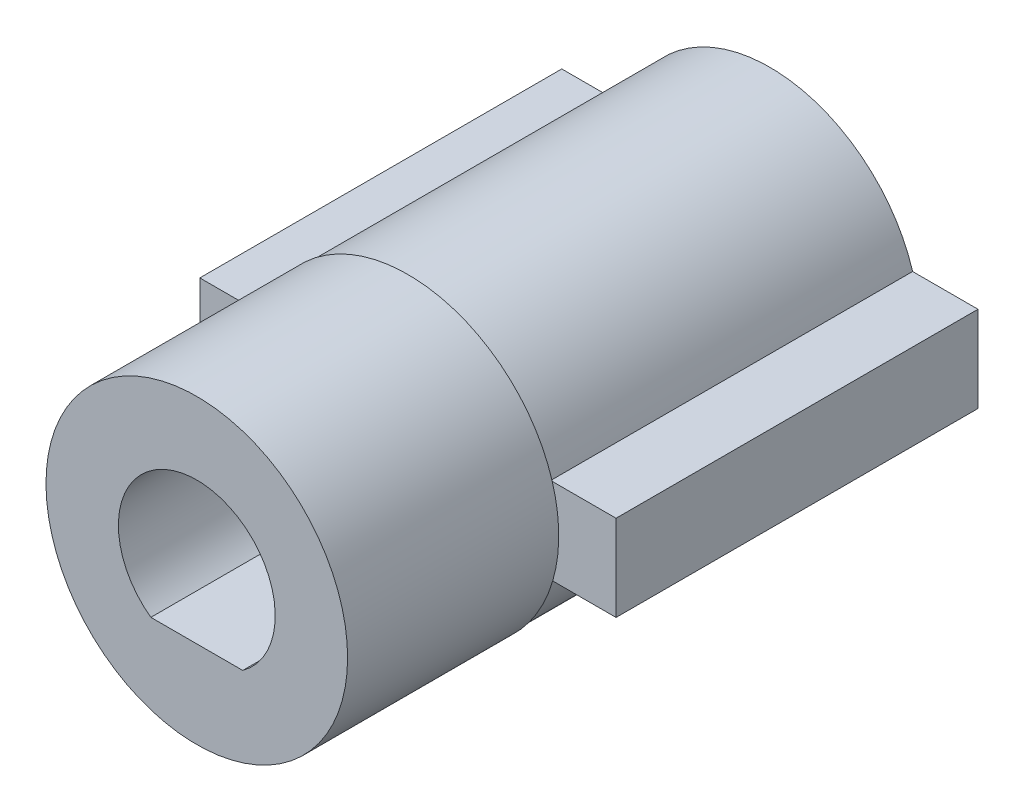
ISO-10303-21;
HEADER;
FILE_DESCRIPTION(('STEP AP214'),'2;1');
FILE_NAME('part.step','',(''),(''),'','','');
FILE_SCHEMA(('AUTOMOTIVE_DESIGN { 1 0 10303 214 1 1 1 1 }'));
ENDSEC;
DATA;
#1=APPLICATION_CONTEXT('core data for automotive mechanical design processes');
#2=APPLICATION_PROTOCOL_DEFINITION('international standard','automotive_design',2000,#1);
#3=PRODUCT_CONTEXT('',#1,'mechanical');
#4=PRODUCT('Part','Part','',(#3));
#5=PRODUCT_RELATED_PRODUCT_CATEGORY('part','',(#4));
#6=PRODUCT_DEFINITION_FORMATION('','',#4);
#7=PRODUCT_DEFINITION_CONTEXT('part definition',#1,'design');
#8=PRODUCT_DEFINITION('design','',#6,#7);
#9=PRODUCT_DEFINITION_SHAPE('','',#8);
#10=(LENGTH_UNIT() NAMED_UNIT(*) SI_UNIT(.MILLI.,.METRE.));
#11=(NAMED_UNIT(*) PLANE_ANGLE_UNIT() SI_UNIT($,.RADIAN.));
#12=(NAMED_UNIT(*) SI_UNIT($,.STERADIAN.) SOLID_ANGLE_UNIT());
#13=UNCERTAINTY_MEASURE_WITH_UNIT(LENGTH_MEASURE(1.E-05),#10,'distance_accuracy_value','');
#14=(GEOMETRIC_REPRESENTATION_CONTEXT(3) GLOBAL_UNCERTAINTY_ASSIGNED_CONTEXT((#13)) GLOBAL_UNIT_ASSIGNED_CONTEXT((#10,
#11,#12)) REPRESENTATION_CONTEXT('',''));
#15=CARTESIAN_POINT('',(0.,0.,0.));
#16=DIRECTION('',(0.,0.,1.));
#17=DIRECTION('',(1.,0.,0.));
#18=AXIS2_PLACEMENT_3D('',#15,#16,#17);
#19=CARTESIAN_POINT('',(0.,0.,12.));
#20=DIRECTION('',(0.,0.,1.));
#21=DIRECTION('',(1.,0.,0.));
#22=AXIS2_PLACEMENT_3D('',#19,#20,#21);
#23=PLANE('',#22);
#24=CARTESIAN_POINT('',(0.,0.,12.));
#25=DIRECTION('',(0.,0.,1.));
#26=DIRECTION('',(1.,0.,0.));
#27=AXIS2_PLACEMENT_3D('',#24,#25,#26);
#28=CIRCLE('',#27,5.);
#29=CARTESIAN_POINT('',(-4.78476498801188,1.45121466692412,12.));
#30=VERTEX_POINT('',#29);
#31=CARTESIAN_POINT('',(-4.80035411110178,-1.39878533307588,12.));
#32=VERTEX_POINT('',#31);
#33=EDGE_CURVE('E47',#30,#32,#28,.T.);
#34=ORIENTED_EDGE('',*,*,#33,.F.);
#35=DIRECTION('',(-1.,0.,0.));
#36=VECTOR('',#35,1.);
#37=CARTESIAN_POINT('',(-6.9,1.45121466692412,12.));
#38=LINE('',#37,#36);
#39=CARTESIAN_POINT('',(-6.9,1.45121466692412,12.));
#40=VERTEX_POINT('',#39);
#41=EDGE_CURVE('E169',#30,#40,#38,.T.);
#42=ORIENTED_EDGE('',*,*,#41,.T.);
#43=DIRECTION('',(0.,-1.,0.));
#44=VECTOR('',#43,1.);
#45=CARTESIAN_POINT('',(-6.9,-1.39878533307588,12.));
#46=LINE('',#45,#44);
#47=CARTESIAN_POINT('',(-6.9,-1.39878533307588,12.));
#48=VERTEX_POINT('',#47);
#49=EDGE_CURVE('E174',#40,#48,#46,.T.);
#50=ORIENTED_EDGE('',*,*,#49,.T.);
#51=DIRECTION('',(1.,0.,0.));
#52=VECTOR('',#51,1.);
#53=CARTESIAN_POINT('',(-6.9,-1.39878533307588,12.));
#54=LINE('',#53,#52);
#55=EDGE_CURVE('E177',#48,#32,#54,.T.);
#56=ORIENTED_EDGE('',*,*,#55,.T.);
#57=EDGE_LOOP('',(#34,#42,#50,#56));
#58=FACE_BOUND('',#57,.T.);
#59=ADVANCED_FACE('F39',(#58),#23,.T.);
#60=CARTESIAN_POINT('',(4.80035411110178,-1.39878533307588,12.));
#61=VERTEX_POINT('',#60);
#62=CARTESIAN_POINT('',(4.78476498801188,1.45121466692412,12.));
#63=VERTEX_POINT('',#62);
#64=EDGE_CURVE('E60',#61,#63,#28,.T.);
#65=ORIENTED_EDGE('',*,*,#64,.F.);
#66=DIRECTION('',(1.,0.,0.));
#67=VECTOR('',#66,1.);
#68=CARTESIAN_POINT('',(4.74825226709489,-1.39878533307588,12.));
#69=LINE('',#68,#67);
#70=CARTESIAN_POINT('',(6.9,-1.39878533307588,12.));
#71=VERTEX_POINT('',#70);
#72=EDGE_CURVE('E183',#61,#71,#69,.T.);
#73=ORIENTED_EDGE('',*,*,#72,.T.);
#74=DIRECTION('',(0.,1.,0.));
#75=VECTOR('',#74,1.);
#76=CARTESIAN_POINT('',(6.9,-1.39878533307588,12.));
#77=LINE('',#76,#75);
#78=CARTESIAN_POINT('',(6.9,1.45121466692412,12.));
#79=VERTEX_POINT('',#78);
#80=EDGE_CURVE('E187',#71,#79,#77,.T.);
#81=ORIENTED_EDGE('',*,*,#80,.T.);
#82=DIRECTION('',(-1.,0.,0.));
#83=VECTOR('',#82,1.);
#84=CARTESIAN_POINT('',(4.73249152038377,1.45121466692412,12.));
#85=LINE('',#84,#83);
#86=EDGE_CURVE('E190',#79,#63,#85,.T.);
#87=ORIENTED_EDGE('',*,*,#86,.T.);
#88=EDGE_LOOP('',(#65,#73,#81,#87));
#89=FACE_BOUND('',#88,.T.);
#90=ADVANCED_FACE('F246',(#89),#23,.T.);
#91=CARTESIAN_POINT('',(0.,0.,0.));
#92=DIRECTION('',(0.,0.,1.));
#93=DIRECTION('',(1.,0.,0.));
#94=AXIS2_PLACEMENT_3D('',#91,#92,#93);
#95=PLANE('',#94);
#96=CARTESIAN_POINT('',(0.,0.,0.));
#97=DIRECTION('',(0.,0.,1.));
#98=DIRECTION('',(1.,0.,0.));
#99=AXIS2_PLACEMENT_3D('',#96,#97,#98);
#100=CIRCLE('',#99,4.95);
#101=CARTESIAN_POINT('',(4.73249152038377,1.45121466692412,0.));
#102=VERTEX_POINT('',#101);
#103=CARTESIAN_POINT('',(-4.73249152038377,1.45121466692412,0.));
#104=VERTEX_POINT('',#103);
#105=EDGE_CURVE('E165',#102,#104,#100,.T.);
#106=ORIENTED_EDGE('',*,*,#105,.F.);
#107=DIRECTION('',(-1.,0.,0.));
#108=VECTOR('',#107,1.);
#109=CARTESIAN_POINT('',(4.73249152038377,1.45121466692412,0.));
#110=LINE('',#109,#108);
#111=CARTESIAN_POINT('',(6.9,1.45121466692412,0.));
#112=VERTEX_POINT('',#111);
#113=EDGE_CURVE('E170',#112,#102,#110,.T.);
#114=ORIENTED_EDGE('',*,*,#113,.F.);
#115=DIRECTION('',(0.,1.,0.));
#116=VECTOR('',#115,1.);
#117=CARTESIAN_POINT('',(6.9,-1.39878533307588,0.));
#118=LINE('',#117,#116);
#119=CARTESIAN_POINT('',(6.9,-1.39878533307588,0.));
#120=VERTEX_POINT('',#119);
#121=EDGE_CURVE('E205',#120,#112,#118,.T.);
#122=ORIENTED_EDGE('',*,*,#121,.F.);
#123=DIRECTION('',(1.,0.,0.));
#124=VECTOR('',#123,1.);
#125=CARTESIAN_POINT('',(4.74825226709489,-1.39878533307588,0.));
#126=LINE('',#125,#124);
#127=CARTESIAN_POINT('',(4.74825226709489,-1.39878533307588,0.));
#128=VERTEX_POINT('',#127);
#129=EDGE_CURVE('E203',#128,#120,#126,.T.);
#130=ORIENTED_EDGE('',*,*,#129,.F.);
#131=CARTESIAN_POINT('',(0.,0.,0.));
#132=DIRECTION('',(0.,0.,1.));
#133=DIRECTION('',(1.,0.,0.));
#134=AXIS2_PLACEMENT_3D('',#131,#132,#133);
#135=CIRCLE('',#134,4.95);
#136=CARTESIAN_POINT('',(-4.74825226709489,-1.39878533307588,0.));
#137=VERTEX_POINT('',#136);
#138=EDGE_CURVE('E201',#137,#128,#135,.T.);
#139=ORIENTED_EDGE('',*,*,#138,.F.);
#140=DIRECTION('',(1.,0.,0.));
#141=VECTOR('',#140,1.);
#142=CARTESIAN_POINT('',(-6.9,-1.39878533307588,0.));
#143=LINE('',#142,#141);
#144=CARTESIAN_POINT('',(-6.9,-1.39878533307588,0.));
#145=VERTEX_POINT('',#144);
#146=EDGE_CURVE('E199',#145,#137,#143,.T.);
#147=ORIENTED_EDGE('',*,*,#146,.F.);
#148=DIRECTION('',(0.,-1.,0.));
#149=VECTOR('',#148,1.);
#150=CARTESIAN_POINT('',(-6.9,-1.39878533307588,0.));
#151=LINE('',#150,#149);
#152=CARTESIAN_POINT('',(-6.9,1.45121466692412,0.));
#153=VERTEX_POINT('',#152);
#154=EDGE_CURVE('E197',#153,#145,#151,.T.);
#155=ORIENTED_EDGE('',*,*,#154,.F.);
#156=DIRECTION('',(-1.,0.,0.));
#157=VECTOR('',#156,1.);
#158=CARTESIAN_POINT('',(-6.9,1.45121466692412,0.));
#159=LINE('',#158,#157);
#160=EDGE_CURVE('E195',#104,#153,#159,.T.);
#161=ORIENTED_EDGE('',*,*,#160,.F.);
#162=EDGE_LOOP('',(#106,#114,#122,#130,#139,#147,#155,#161));
#163=FACE_BOUND('',#162,.T.);
#164=CARTESIAN_POINT('',(0.,0.,0.));
#165=DIRECTION('',(0.,0.,1.));
#166=DIRECTION('',(1.,0.,0.));
#167=AXIS2_PLACEMENT_3D('',#164,#165,#166);
#168=CIRCLE('',#167,1.49);
#169=CARTESIAN_POINT('',(1.49,0.,0.));
#170=VERTEX_POINT('',#169);
#171=EDGE_CURVE('E151',#170,#170,#168,.T.);
#172=ORIENTED_EDGE('',*,*,#171,.T.);
#173=EDGE_LOOP('',(#172));
#174=FACE_BOUND('',#173,.T.);
#175=ADVANCED_FACE('F266',(#163,#174),#95,.F.);
#176=CARTESIAN_POINT('',(0.,0.,12.));
#177=DIRECTION('',(0.,0.,-1.));
#178=DIRECTION('',(-1.,0.,0.));
#179=AXIS2_PLACEMENT_3D('',#176,#177,#178);
#180=CYLINDRICAL_SURFACE('',#179,4.95);
#181=ORIENTED_EDGE('',*,*,#105,.T.);
#182=DIRECTION('',(0.,0.,-1.));
#183=VECTOR('',#182,1.);
#184=CARTESIAN_POINT('',(-4.73249152038377,1.45121466692412,12.));
#185=LINE('',#184,#183);
#186=CARTESIAN_POINT('',(-4.73249152038377,1.45121466692412,12.));
#187=VERTEX_POINT('',#186);
#188=EDGE_CURVE('E227',#187,#104,#185,.T.);
#189=ORIENTED_EDGE('',*,*,#188,.F.);
#190=CARTESIAN_POINT('',(0.,0.,12.));
#191=DIRECTION('',(0.,0.,1.));
#192=DIRECTION('',(1.,0.,0.));
#193=AXIS2_PLACEMENT_3D('',#190,#191,#192);
#194=CIRCLE('',#193,4.95);
#195=CARTESIAN_POINT('',(4.73249152038377,1.45121466692412,12.));
#196=VERTEX_POINT('',#195);
#197=EDGE_CURVE('E166',#196,#187,#194,.T.);
#198=ORIENTED_EDGE('',*,*,#197,.F.);
#199=DIRECTION('',(0.,0.,-1.));
#200=VECTOR('',#199,1.);
#201=CARTESIAN_POINT('',(4.73249152038377,1.45121466692412,12.));
#202=LINE('',#201,#200);
#203=EDGE_CURVE('E192',#196,#102,#202,.T.);
#204=ORIENTED_EDGE('',*,*,#203,.T.);
#205=EDGE_LOOP('',(#181,#189,#198,#204));
#206=FACE_BOUND('',#205,.T.);
#207=ADVANCED_FACE('F41',(#206),#180,.T.);
#208=CARTESIAN_POINT('',(-6.9,1.45121466692412,12.));
#209=DIRECTION('',(0.,-1.,0.));
#210=DIRECTION('',(0.,0.,-1.));
#211=AXIS2_PLACEMENT_3D('',#208,#209,#210);
#212=PLANE('',#211);
#213=ORIENTED_EDGE('',*,*,#160,.T.);
#214=DIRECTION('',(0.,0.,-1.));
#215=VECTOR('',#214,1.);
#216=CARTESIAN_POINT('',(-6.9,1.45121466692412,12.));
#217=LINE('',#216,#215);
#218=EDGE_CURVE('E225',#40,#153,#217,.T.);
#219=ORIENTED_EDGE('',*,*,#218,.F.);
#220=ORIENTED_EDGE('',*,*,#41,.F.);
#221=EDGE_CURVE('E171',#187,#30,#38,.T.);
#222=ORIENTED_EDGE('',*,*,#221,.F.);
#223=ORIENTED_EDGE('',*,*,#188,.T.);
#224=EDGE_LOOP('',(#213,#219,#220,#222,#223));
#225=FACE_BOUND('',#224,.T.);
#226=ADVANCED_FACE('F261',(#225),#212,.F.);
#227=CARTESIAN_POINT('',(-6.9,-1.39878533307588,12.));
#228=DIRECTION('',(1.,0.,0.));
#229=DIRECTION('',(0.,1.,0.));
#230=AXIS2_PLACEMENT_3D('',#227,#228,#229);
#231=PLANE('',#230);
#232=ORIENTED_EDGE('',*,*,#154,.T.);
#233=DIRECTION('',(0.,0.,-1.));
#234=VECTOR('',#233,1.);
#235=CARTESIAN_POINT('',(-6.9,-1.39878533307588,12.));
#236=LINE('',#235,#234);
#237=EDGE_CURVE('E222',#48,#145,#236,.T.);
#238=ORIENTED_EDGE('',*,*,#237,.F.);
#239=ORIENTED_EDGE('',*,*,#49,.F.);
#240=ORIENTED_EDGE('',*,*,#218,.T.);
#241=EDGE_LOOP('',(#232,#238,#239,#240));
#242=FACE_BOUND('',#241,.T.);
#243=ADVANCED_FACE('F272',(#242),#231,.F.);
#244=CARTESIAN_POINT('',(-6.9,-1.39878533307588,12.));
#245=DIRECTION('',(0.,1.,0.));
#246=DIRECTION('',(0.,0.,1.));
#247=AXIS2_PLACEMENT_3D('',#244,#245,#246);
#248=PLANE('',#247);
#249=ORIENTED_EDGE('',*,*,#146,.T.);
#250=DIRECTION('',(0.,0.,-1.));
#251=VECTOR('',#250,1.);
#252=CARTESIAN_POINT('',(-4.74825226709489,-1.39878533307588,12.));
#253=LINE('',#252,#251);
#254=CARTESIAN_POINT('',(-4.74825226709489,-1.39878533307588,12.));
#255=VERTEX_POINT('',#254);
#256=EDGE_CURVE('E219',#255,#137,#253,.T.);
#257=ORIENTED_EDGE('',*,*,#256,.F.);
#258=EDGE_CURVE('E176',#32,#255,#54,.T.);
#259=ORIENTED_EDGE('',*,*,#258,.F.);
#260=ORIENTED_EDGE('',*,*,#55,.F.);
#261=ORIENTED_EDGE('',*,*,#237,.T.);
#262=EDGE_LOOP('',(#249,#257,#259,#260,#261));
#263=FACE_BOUND('',#262,.T.);
#264=ADVANCED_FACE('F277',(#263),#248,.F.);
#265=CARTESIAN_POINT('',(0.,0.,12.));
#266=DIRECTION('',(0.,0.,-1.));
#267=DIRECTION('',(-1.,0.,0.));
#268=AXIS2_PLACEMENT_3D('',#265,#266,#267);
#269=CYLINDRICAL_SURFACE('',#268,4.95);
#270=ORIENTED_EDGE('',*,*,#138,.T.);
#271=DIRECTION('',(0.,0.,-1.));
#272=VECTOR('',#271,1.);
#273=CARTESIAN_POINT('',(4.74825226709489,-1.39878533307588,12.));
#274=LINE('',#273,#272);
#275=CARTESIAN_POINT('',(4.74825226709489,-1.39878533307588,12.));
#276=VERTEX_POINT('',#275);
#277=EDGE_CURVE('E216',#276,#128,#274,.T.);
#278=ORIENTED_EDGE('',*,*,#277,.F.);
#279=CARTESIAN_POINT('',(0.,0.,12.));
#280=DIRECTION('',(0.,0.,1.));
#281=DIRECTION('',(1.,0.,0.));
#282=AXIS2_PLACEMENT_3D('',#279,#280,#281);
#283=CIRCLE('',#282,4.95);
#284=EDGE_CURVE('E180',#255,#276,#283,.T.);
#285=ORIENTED_EDGE('',*,*,#284,.F.);
#286=ORIENTED_EDGE('',*,*,#256,.T.);
#287=EDGE_LOOP('',(#270,#278,#285,#286));
#288=FACE_BOUND('',#287,.T.);
#289=ADVANCED_FACE('F280',(#288),#269,.T.);
#290=CARTESIAN_POINT('',(4.74825226709489,-1.39878533307588,12.));
#291=DIRECTION('',(0.,1.,0.));
#292=DIRECTION('',(0.,0.,1.));
#293=AXIS2_PLACEMENT_3D('',#290,#291,#292);
#294=PLANE('',#293);
#295=ORIENTED_EDGE('',*,*,#129,.T.);
#296=DIRECTION('',(0.,0.,-1.));
#297=VECTOR('',#296,1.);
#298=CARTESIAN_POINT('',(6.9,-1.39878533307588,12.));
#299=LINE('',#298,#297);
#300=EDGE_CURVE('E213',#71,#120,#299,.T.);
#301=ORIENTED_EDGE('',*,*,#300,.F.);
#302=ORIENTED_EDGE('',*,*,#72,.F.);
#303=EDGE_CURVE('E184',#276,#61,#69,.T.);
#304=ORIENTED_EDGE('',*,*,#303,.F.);
#305=ORIENTED_EDGE('',*,*,#277,.T.);
#306=EDGE_LOOP('',(#295,#301,#302,#304,#305));
#307=FACE_BOUND('',#306,.T.);
#308=ADVANCED_FACE('F242',(#307),#294,.F.);
#309=CARTESIAN_POINT('',(6.9,-1.39878533307588,12.));
#310=DIRECTION('',(-1.,0.,0.));
#311=DIRECTION('',(0.,-1.,0.));
#312=AXIS2_PLACEMENT_3D('',#309,#310,#311);
#313=PLANE('',#312);
#314=ORIENTED_EDGE('',*,*,#121,.T.);
#315=DIRECTION('',(0.,0.,-1.));
#316=VECTOR('',#315,1.);
#317=CARTESIAN_POINT('',(6.9,1.45121466692412,12.));
#318=LINE('',#317,#316);
#319=EDGE_CURVE('E210',#79,#112,#318,.T.);
#320=ORIENTED_EDGE('',*,*,#319,.F.);
#321=ORIENTED_EDGE('',*,*,#80,.F.);
#322=ORIENTED_EDGE('',*,*,#300,.T.);
#323=EDGE_LOOP('',(#314,#320,#321,#322));
#324=FACE_BOUND('',#323,.T.);
#325=ADVANCED_FACE('F251',(#324),#313,.F.);
#326=CARTESIAN_POINT('',(4.73249152038377,1.45121466692412,12.));
#327=DIRECTION('',(0.,-1.,0.));
#328=DIRECTION('',(0.,0.,-1.));
#329=AXIS2_PLACEMENT_3D('',#326,#327,#328);
#330=PLANE('',#329);
#331=ORIENTED_EDGE('',*,*,#113,.T.);
#332=ORIENTED_EDGE('',*,*,#203,.F.);
#333=EDGE_CURVE('E189',#63,#196,#85,.T.);
#334=ORIENTED_EDGE('',*,*,#333,.F.);
#335=ORIENTED_EDGE('',*,*,#86,.F.);
#336=ORIENTED_EDGE('',*,*,#319,.T.);
#337=EDGE_LOOP('',(#331,#332,#334,#335,#336));
#338=FACE_BOUND('',#337,.T.);
#339=ADVANCED_FACE('F255',(#338),#330,.F.);
#340=CARTESIAN_POINT('',(0.,0.,12.));
#341=DIRECTION('',(0.,0.,-1.));
#342=DIRECTION('',(-1.,0.,0.));
#343=AXIS2_PLACEMENT_3D('',#340,#341,#342);
#344=CYLINDRICAL_SURFACE('',#343,2.6);
#345=CARTESIAN_POINT('',(0.,0.,8.));
#346=DIRECTION('',(0.,0.,1.));
#347=DIRECTION('',(1.,0.,0.));
#348=AXIS2_PLACEMENT_3D('',#345,#346,#347);
#349=CIRCLE('',#348,2.6);
#350=CARTESIAN_POINT('',(1.52372356621064,-2.10671936758893,8.));
#351=VERTEX_POINT('',#350);
#352=CARTESIAN_POINT('',(-1.52372356621064,-2.10671936758893,8.));
#353=VERTEX_POINT('',#352);
#354=EDGE_CURVE('E136',#351,#353,#349,.T.);
#355=ORIENTED_EDGE('',*,*,#354,.F.);
#356=DIRECTION('',(0.,0.,-1.));
#357=VECTOR('',#356,1.);
#358=CARTESIAN_POINT('',(1.52372356621064,-2.10671936758893,12.));
#359=LINE('',#358,#357);
#360=CARTESIAN_POINT('',(1.52372356621064,-2.10671936758893,19.));
#361=VERTEX_POINT('',#360);
#362=EDGE_CURVE('E124',#361,#351,#359,.T.);
#363=ORIENTED_EDGE('',*,*,#362,.F.);
#364=CARTESIAN_POINT('',(0.,0.,19.));
#365=DIRECTION('',(0.,0.,1.));
#366=DIRECTION('',(1.,0.,0.));
#367=AXIS2_PLACEMENT_3D('',#364,#365,#366);
#368=CIRCLE('',#367,2.6);
#369=CARTESIAN_POINT('',(-1.52372356621064,-2.10671936758893,19.));
#370=VERTEX_POINT('',#369);
#371=EDGE_CURVE('E139',#361,#370,#368,.T.);
#372=ORIENTED_EDGE('',*,*,#371,.T.);
#373=DIRECTION('',(0.,0.,-1.));
#374=VECTOR('',#373,1.);
#375=CARTESIAN_POINT('',(-1.52372356621064,-2.10671936758893,12.));
#376=LINE('',#375,#374);
#377=EDGE_CURVE('E132',#370,#353,#376,.T.);
#378=ORIENTED_EDGE('',*,*,#377,.T.);
#379=EDGE_LOOP('',(#355,#363,#372,#378));
#380=FACE_BOUND('',#379,.T.);
#381=ADVANCED_FACE('F137',(#380),#344,.F.);
#382=CARTESIAN_POINT('',(1.52372356621064,-2.10671936758893,12.));
#383=DIRECTION('',(0.,1.,0.));
#384=DIRECTION('',(0.,0.,1.));
#385=AXIS2_PLACEMENT_3D('',#382,#383,#384);
#386=PLANE('',#385);
#387=DIRECTION('',(1.,0.,0.));
#388=VECTOR('',#387,1.);
#389=CARTESIAN_POINT('',(1.52372356621064,-2.10671936758893,8.));
#390=LINE('',#389,#388);
#391=EDGE_CURVE('E11',#353,#351,#390,.T.);
#392=ORIENTED_EDGE('',*,*,#391,.F.);
#393=ORIENTED_EDGE('',*,*,#377,.F.);
#394=DIRECTION('',(1.,0.,0.));
#395=VECTOR('',#394,1.);
#396=CARTESIAN_POINT('',(-1.52372356621064,-2.10671936758893,19.));
#397=LINE('',#396,#395);
#398=EDGE_CURVE('E128',#370,#361,#397,.T.);
#399=ORIENTED_EDGE('',*,*,#398,.T.);
#400=ORIENTED_EDGE('',*,*,#362,.T.);
#401=EDGE_LOOP('',(#392,#393,#399,#400));
#402=FACE_BOUND('',#401,.T.);
#403=ADVANCED_FACE('F126',(#402),#386,.T.);
#404=CARTESIAN_POINT('',(0.,0.,12.));
#405=DIRECTION('',(0.,0.,1.));
#406=DIRECTION('',(1.,0.,0.));
#407=AXIS2_PLACEMENT_3D('',#404,#405,#406);
#408=PLANE('',#407);
#409=EDGE_CURVE('E158',#32,#61,#28,.T.);
#410=ORIENTED_EDGE('',*,*,#409,.F.);
#411=ORIENTED_EDGE('',*,*,#258,.T.);
#412=ORIENTED_EDGE('',*,*,#284,.T.);
#413=ORIENTED_EDGE('',*,*,#303,.T.);
#414=EDGE_LOOP('',(#410,#411,#412,#413));
#415=FACE_BOUND('',#414,.T.);
#416=ADVANCED_FACE('F238',(#415),#408,.F.);
#417=ORIENTED_EDGE('',*,*,#197,.T.);
#418=ORIENTED_EDGE('',*,*,#221,.T.);
#419=EDGE_CURVE('E161',#63,#30,#28,.T.);
#420=ORIENTED_EDGE('',*,*,#419,.F.);
#421=ORIENTED_EDGE('',*,*,#333,.T.);
#422=EDGE_LOOP('',(#417,#418,#420,#421));
#423=FACE_BOUND('',#422,.T.);
#424=ADVANCED_FACE('F259',(#423),#408,.F.);
#425=CARTESIAN_POINT('',(0.,0.,19.));
#426=DIRECTION('',(0.,0.,1.));
#427=DIRECTION('',(1.,0.,0.));
#428=AXIS2_PLACEMENT_3D('',#425,#426,#427);
#429=PLANE('',#428);
#430=CARTESIAN_POINT('',(0.,0.,19.));
#431=DIRECTION('',(0.,0.,1.));
#432=DIRECTION('',(1.,0.,0.));
#433=AXIS2_PLACEMENT_3D('',#430,#431,#432);
#434=CIRCLE('',#433,5.);
#435=CARTESIAN_POINT('',(5.,0.,19.));
#436=VERTEX_POINT('',#435);
#437=EDGE_CURVE('E133',#436,#436,#434,.T.);
#438=ORIENTED_EDGE('',*,*,#437,.T.);
#439=EDGE_LOOP('',(#438));
#440=FACE_BOUND('',#439,.T.);
#441=ORIENTED_EDGE('',*,*,#398,.F.);
#442=ORIENTED_EDGE('',*,*,#371,.F.);
#443=EDGE_LOOP('',(#441,#442));
#444=FACE_BOUND('',#443,.T.);
#445=ADVANCED_FACE('F355',(#440,#444),#429,.T.);
#446=CARTESIAN_POINT('',(0.,0.,19.));
#447=DIRECTION('',(0.,0.,-1.));
#448=DIRECTION('',(-1.,0.,0.));
#449=AXIS2_PLACEMENT_3D('',#446,#447,#448);
#450=CYLINDRICAL_SURFACE('',#449,5.);
#451=ORIENTED_EDGE('',*,*,#437,.F.);
#452=EDGE_LOOP('',(#451));
#453=FACE_BOUND('',#452,.T.);
#454=ORIENTED_EDGE('',*,*,#419,.T.);
#455=ORIENTED_EDGE('',*,*,#33,.T.);
#456=ORIENTED_EDGE('',*,*,#409,.T.);
#457=ORIENTED_EDGE('',*,*,#64,.T.);
#458=EDGE_LOOP('',(#454,#455,#456,#457));
#459=FACE_BOUND('',#458,.T.);
#460=ADVANCED_FACE('F146',(#453,#459),#450,.T.);
#461=CARTESIAN_POINT('',(0.,0.,8.));
#462=DIRECTION('',(0.,0.,1.));
#463=DIRECTION('',(1.,0.,0.));
#464=AXIS2_PLACEMENT_3D('',#461,#462,#463);
#465=PLANE('',#464);
#466=ORIENTED_EDGE('',*,*,#391,.T.);
#467=ORIENTED_EDGE('',*,*,#354,.T.);
#468=EDGE_LOOP('',(#466,#467));
#469=FACE_BOUND('',#468,.T.);
#470=CARTESIAN_POINT('',(0.,0.,8.));
#471=DIRECTION('',(0.,0.,1.));
#472=DIRECTION('',(1.,0.,0.));
#473=AXIS2_PLACEMENT_3D('',#470,#471,#472);
#474=CIRCLE('',#473,1.49);
#475=CARTESIAN_POINT('',(1.49,0.,8.));
#476=VERTEX_POINT('',#475);
#477=EDGE_CURVE('E140',#476,#476,#474,.T.);
#478=ORIENTED_EDGE('',*,*,#477,.F.);
#479=EDGE_LOOP('',(#478));
#480=FACE_BOUND('',#479,.T.);
#481=ADVANCED_FACE('F142',(#469,#480),#465,.T.);
#482=CARTESIAN_POINT('',(0.,0.,8.));
#483=DIRECTION('',(0.,0.,-1.));
#484=DIRECTION('',(-1.,0.,0.));
#485=AXIS2_PLACEMENT_3D('',#482,#483,#484);
#486=CYLINDRICAL_SURFACE('',#485,1.49);
#487=ORIENTED_EDGE('',*,*,#477,.T.);
#488=EDGE_LOOP('',(#487));
#489=FACE_BOUND('',#488,.T.);
#490=ORIENTED_EDGE('',*,*,#171,.F.);
#491=EDGE_LOOP('',(#490));
#492=FACE_BOUND('',#491,.T.);
#493=ADVANCED_FACE('F145',(#489,#492),#486,.F.);
#494=CLOSED_SHELL('',(#59,#90,#175,#207,#226,#243,#264,#289,#308,#325,#339,#381,#403,#416,#424,
#445,#460,#481,#493));
#495=MANIFOLD_SOLID_BREP('B2',#494);
#496=ADVANCED_BREP_SHAPE_REPRESENTATION('',(#18,#495),#14);
#497=SHAPE_DEFINITION_REPRESENTATION(#9,#496);
ENDSEC;
END-ISO-10303-21;
